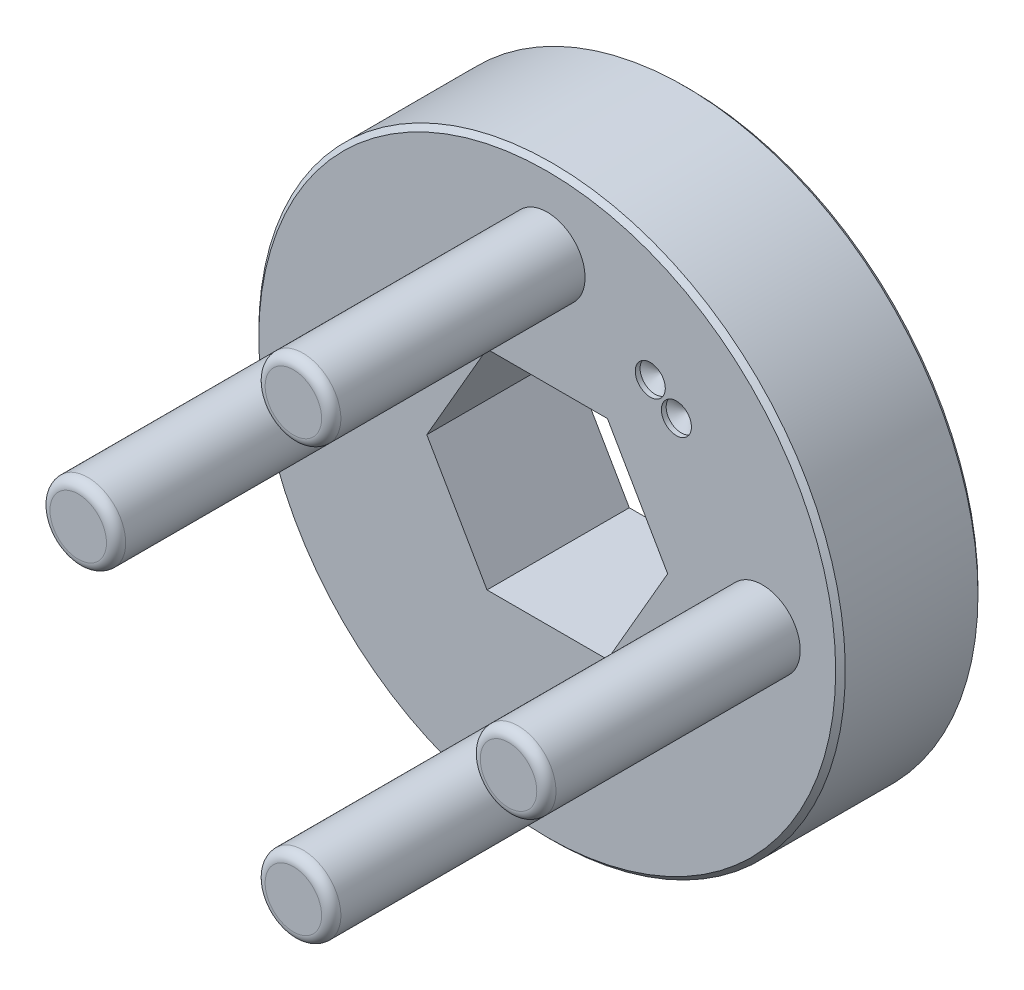
ISO-10303-21;
HEADER;
FILE_DESCRIPTION(('STEP AP214'),'2;1');
FILE_NAME('part.step','',(''),(''),'','','');
FILE_SCHEMA(('AUTOMOTIVE_DESIGN { 1 0 10303 214 1 1 1 1 }'));
ENDSEC;
DATA;
#1=APPLICATION_CONTEXT('core data for automotive mechanical design processes');
#2=APPLICATION_PROTOCOL_DEFINITION('international standard','automotive_design',2000,#1);
#3=PRODUCT_CONTEXT('',#1,'mechanical');
#4=PRODUCT('Part','Part','',(#3));
#5=PRODUCT_RELATED_PRODUCT_CATEGORY('part','',(#4));
#6=PRODUCT_DEFINITION_FORMATION('','',#4);
#7=PRODUCT_DEFINITION_CONTEXT('part definition',#1,'design');
#8=PRODUCT_DEFINITION('design','',#6,#7);
#9=PRODUCT_DEFINITION_SHAPE('','',#8);
#10=(LENGTH_UNIT() NAMED_UNIT(*) SI_UNIT(.MILLI.,.METRE.));
#11=(NAMED_UNIT(*) PLANE_ANGLE_UNIT() SI_UNIT($,.RADIAN.));
#12=(NAMED_UNIT(*) SI_UNIT($,.STERADIAN.) SOLID_ANGLE_UNIT());
#13=UNCERTAINTY_MEASURE_WITH_UNIT(LENGTH_MEASURE(1.E-05),#10,'distance_accuracy_value','');
#14=(GEOMETRIC_REPRESENTATION_CONTEXT(3) GLOBAL_UNCERTAINTY_ASSIGNED_CONTEXT((#13)) GLOBAL_UNIT_ASSIGNED_CONTEXT((#10,
#11,#12)) REPRESENTATION_CONTEXT('',''));
#15=CARTESIAN_POINT('',(0.,0.,0.));
#16=DIRECTION('',(0.,0.,1.));
#17=DIRECTION('',(1.,0.,0.));
#18=AXIS2_PLACEMENT_3D('',#15,#16,#17);
#19=CARTESIAN_POINT('',(-11.3665,1.19057767913881E-13,20.9296));
#20=DIRECTION('',(0.,0.,1.));
#21=DIRECTION('',(1.,0.,0.));
#22=AXIS2_PLACEMENT_3D('',#19,#20,#21);
#23=PLANE('',#22);
#24=CARTESIAN_POINT('',(-11.3665,1.19057767913881E-13,20.9296));
#25=DIRECTION('',(0.,0.,-1.));
#26=DIRECTION('',(-1.,0.,0.));
#27=AXIS2_PLACEMENT_3D('',#24,#25,#26);
#28=CIRCLE('',#27,1.492);
#29=CARTESIAN_POINT('',(-12.8585,1.19252927627794E-13,20.9296));
#30=VERTEX_POINT('',#29);
#31=CARTESIAN_POINT('',(-9.8745,1.19057767913881E-13,20.9296));
#32=VERTEX_POINT('',#31);
#33=EDGE_CURVE('E216',#30,#32,#28,.T.);
#34=ORIENTED_EDGE('',*,*,#33,.F.);
#35=CARTESIAN_POINT('',(-11.3665,1.19057767913881E-13,20.9296));
#36=DIRECTION('',(0.,0.,-1.));
#37=DIRECTION('',(1.,0.,0.));
#38=AXIS2_PLACEMENT_3D('',#35,#36,#37);
#39=CIRCLE('',#38,1.492);
#40=EDGE_CURVE('E213',#32,#30,#39,.T.);
#41=ORIENTED_EDGE('',*,*,#40,.F.);
#42=EDGE_LOOP('',(#34,#41));
#43=FACE_BOUND('',#42,.T.);
#44=ADVANCED_FACE('F17',(#43),#23,.T.);
#45=CARTESIAN_POINT('',(0.,-11.3665,20.9296));
#46=DIRECTION('',(0.,0.,1.));
#47=DIRECTION('',(1.,0.,0.));
#48=AXIS2_PLACEMENT_3D('',#45,#46,#47);
#49=PLANE('',#48);
#50=CARTESIAN_POINT('',(0.,-11.3665,20.9296));
#51=DIRECTION('',(0.,0.,-1.));
#52=DIRECTION('',(-1.,0.,0.));
#53=AXIS2_PLACEMENT_3D('',#50,#51,#52);
#54=CIRCLE('',#53,1.492);
#55=CARTESIAN_POINT('',(-1.492,-11.3665,20.9296));
#56=VERTEX_POINT('',#55);
#57=CARTESIAN_POINT('',(1.492,-11.3665,20.9296));
#58=VERTEX_POINT('',#57);
#59=EDGE_CURVE('E292',#56,#58,#54,.T.);
#60=ORIENTED_EDGE('',*,*,#59,.F.);
#61=CARTESIAN_POINT('',(0.,-11.3665,20.9296));
#62=DIRECTION('',(0.,0.,-1.));
#63=DIRECTION('',(1.,0.,0.));
#64=AXIS2_PLACEMENT_3D('',#61,#62,#63);
#65=CIRCLE('',#64,1.492);
#66=EDGE_CURVE('E220',#58,#56,#65,.T.);
#67=ORIENTED_EDGE('',*,*,#66,.F.);
#68=EDGE_LOOP('',(#60,#67));
#69=FACE_BOUND('',#68,.T.);
#70=ADVANCED_FACE('F294',(#69),#49,.T.);
#71=CARTESIAN_POINT('',(11.3665,0.,20.9296));
#72=DIRECTION('',(0.,0.,1.));
#73=DIRECTION('',(1.,0.,0.));
#74=AXIS2_PLACEMENT_3D('',#71,#72,#73);
#75=PLANE('',#74);
#76=CARTESIAN_POINT('',(11.3665,0.,20.9296));
#77=DIRECTION('',(0.,0.,-1.));
#78=DIRECTION('',(-1.,0.,0.));
#79=AXIS2_PLACEMENT_3D('',#76,#77,#78);
#80=CIRCLE('',#79,1.492);
#81=CARTESIAN_POINT('',(9.8745,0.,20.9296));
#82=VERTEX_POINT('',#81);
#83=CARTESIAN_POINT('',(12.8585,0.,20.9296));
#84=VERTEX_POINT('',#83);
#85=EDGE_CURVE('E288',#82,#84,#80,.T.);
#86=ORIENTED_EDGE('',*,*,#85,.F.);
#87=CARTESIAN_POINT('',(11.3665,0.,20.9296));
#88=DIRECTION('',(0.,0.,-1.));
#89=DIRECTION('',(1.,0.,0.));
#90=AXIS2_PLACEMENT_3D('',#87,#88,#89);
#91=CIRCLE('',#90,1.492);
#92=EDGE_CURVE('E279',#84,#82,#91,.T.);
#93=ORIENTED_EDGE('',*,*,#92,.F.);
#94=EDGE_LOOP('',(#86,#93));
#95=FACE_BOUND('',#94,.T.);
#96=ADVANCED_FACE('F137',(#95),#75,.T.);
#97=CARTESIAN_POINT('',(0.,11.3665,20.9296));
#98=DIRECTION('',(0.,0.,1.));
#99=DIRECTION('',(1.,0.,0.));
#100=AXIS2_PLACEMENT_3D('',#97,#98,#99);
#101=PLANE('',#100);
#102=CARTESIAN_POINT('',(0.,11.3665,20.9296));
#103=DIRECTION('',(0.,0.,-1.));
#104=DIRECTION('',(-1.,0.,0.));
#105=AXIS2_PLACEMENT_3D('',#102,#103,#104);
#106=CIRCLE('',#105,1.492);
#107=CARTESIAN_POINT('',(-1.492,11.3665,20.9296));
#108=VERTEX_POINT('',#107);
#109=CARTESIAN_POINT('',(1.492,11.3665,20.9296));
#110=VERTEX_POINT('',#109);
#111=EDGE_CURVE('E112',#108,#110,#106,.T.);
#112=ORIENTED_EDGE('',*,*,#111,.F.);
#113=CARTESIAN_POINT('',(0.,11.3665,20.9296));
#114=DIRECTION('',(0.,0.,-1.));
#115=DIRECTION('',(1.,0.,0.));
#116=AXIS2_PLACEMENT_3D('',#113,#114,#115);
#117=CIRCLE('',#116,1.492);
#118=EDGE_CURVE('E117',#110,#108,#117,.T.);
#119=ORIENTED_EDGE('',*,*,#118,.F.);
#120=EDGE_LOOP('',(#112,#119));
#121=FACE_BOUND('',#120,.T.);
#122=ADVANCED_FACE('F105',(#121),#101,.T.);
#123=CARTESIAN_POINT('',(5.44497650823394,8.41824079302751,7.26439999999684));
#124=DIRECTION('',(0.,0.,1.));
#125=DIRECTION('',(0.,-1.,0.));
#126=AXIS2_PLACEMENT_3D('',#123,#124,#125);
#127=CONICAL_SURFACE('',#126,0.793749999995381,1.02974425861255);
#128=CARTESIAN_POINT('',(5.44497650830067,8.41824079302751,6.78746688365095));
#129=VERTEX_POINT('',#128);
#130=VERTEX_LOOP('',#129);
#131=FACE_BOUND('',#130,.T.);
#132=CARTESIAN_POINT('',(5.44497650823394,8.41824079302751,7.2644));
#133=DIRECTION('',(0.,0.,1.));
#134=DIRECTION('',(1.,0.,0.));
#135=AXIS2_PLACEMENT_3D('',#132,#133,#134);
#136=CIRCLE('',#135,0.793749999999994);
#137=CARTESIAN_POINT('',(6.23872650823393,8.41824079302751,7.2644));
#138=VERTEX_POINT('',#137);
#139=EDGE_CURVE('E109',#138,#138,#136,.T.);
#140=ORIENTED_EDGE('',*,*,#139,.T.);
#141=EDGE_LOOP('',(#140));
#142=FACE_BOUND('',#141,.T.);
#143=ADVANCED_FACE('F101',(#131,#142),#127,.F.);
#144=CARTESIAN_POINT('',(6.82406725314877,7.34483855160306,7.26440000011053));
#145=DIRECTION('',(0.,0.,1.));
#146=DIRECTION('',(1.,0.,0.));
#147=AXIS2_PLACEMENT_3D('',#144,#145,#146);
#148=CONICAL_SURFACE('',#147,0.793750000127602,1.0297442586964);
#149=CARTESIAN_POINT('',(6.82406725314877,7.34483855160306,6.78746688373622));
#150=VERTEX_POINT('',#149);
#151=VERTEX_LOOP('',#150);
#152=FACE_BOUND('',#151,.T.);
#153=CARTESIAN_POINT('',(6.82406725314877,7.34483855160306,7.2644));
#154=DIRECTION('',(0.,0.,1.));
#155=DIRECTION('',(1.,0.,0.));
#156=AXIS2_PLACEMENT_3D('',#153,#154,#155);
#157=CIRCLE('',#156,0.793749999999994);
#158=CARTESIAN_POINT('',(7.61781725314876,7.34483855160306,7.2644));
#159=VERTEX_POINT('',#158);
#160=EDGE_CURVE('E111',#159,#159,#157,.T.);
#161=ORIENTED_EDGE('',*,*,#160,.T.);
#162=EDGE_LOOP('',(#161));
#163=FACE_BOUND('',#162,.T.);
#164=ADVANCED_FACE('F104',(#152,#163),#148,.F.);
#165=CARTESIAN_POINT('',(-11.3665,1.19057767913881E-13,20.4216));
#166=DIRECTION('',(0.,0.,1.));
#167=DIRECTION('',(1.,0.,0.));
#168=AXIS2_PLACEMENT_3D('',#165,#166,#167);
#169=TOROIDAL_SURFACE('',#168,1.492,0.508);
#170=ORIENTED_EDGE('',*,*,#40,.T.);
#171=ORIENTED_EDGE('',*,*,#33,.T.);
#172=EDGE_LOOP('',(#170,#171));
#173=FACE_BOUND('',#172,.T.);
#174=CARTESIAN_POINT('',(-11.3665,1.19057767913881E-13,20.4216));
#175=DIRECTION('',(0.,0.,-1.));
#176=DIRECTION('',(-1.,0.,0.));
#177=AXIS2_PLACEMENT_3D('',#174,#175,#176);
#178=CIRCLE('',#177,2.);
#179=CARTESIAN_POINT('',(-13.3665,1.19057767913881E-13,20.4216));
#180=VERTEX_POINT('',#179);
#181=EDGE_CURVE('E115',#180,#180,#178,.T.);
#182=ORIENTED_EDGE('',*,*,#181,.F.);
#183=EDGE_LOOP('',(#182));
#184=FACE_BOUND('',#183,.T.);
#185=ADVANCED_FACE('F192',(#173,#184),#169,.T.);
#186=CARTESIAN_POINT('',(0.,-11.3665,20.4216));
#187=DIRECTION('',(0.,0.,1.));
#188=DIRECTION('',(1.,0.,0.));
#189=AXIS2_PLACEMENT_3D('',#186,#187,#188);
#190=TOROIDAL_SURFACE('',#189,1.492,0.508);
#191=ORIENTED_EDGE('',*,*,#66,.T.);
#192=ORIENTED_EDGE('',*,*,#59,.T.);
#193=EDGE_LOOP('',(#191,#192));
#194=FACE_BOUND('',#193,.T.);
#195=CARTESIAN_POINT('',(0.,-11.3665,20.4216));
#196=DIRECTION('',(0.,0.,-1.));
#197=DIRECTION('',(-1.,0.,0.));
#198=AXIS2_PLACEMENT_3D('',#195,#196,#197);
#199=CIRCLE('',#198,2.);
#200=CARTESIAN_POINT('',(-2.,-11.3665,20.4216));
#201=VERTEX_POINT('',#200);
#202=EDGE_CURVE('E182',#201,#201,#199,.T.);
#203=ORIENTED_EDGE('',*,*,#202,.F.);
#204=EDGE_LOOP('',(#203));
#205=FACE_BOUND('',#204,.T.);
#206=ADVANCED_FACE('F189',(#194,#205),#190,.T.);
#207=CARTESIAN_POINT('',(11.3665,0.,20.4216));
#208=DIRECTION('',(0.,0.,1.));
#209=DIRECTION('',(1.,0.,0.));
#210=AXIS2_PLACEMENT_3D('',#207,#208,#209);
#211=TOROIDAL_SURFACE('',#210,1.492,0.508);
#212=ORIENTED_EDGE('',*,*,#92,.T.);
#213=ORIENTED_EDGE('',*,*,#85,.T.);
#214=EDGE_LOOP('',(#212,#213));
#215=FACE_BOUND('',#214,.T.);
#216=CARTESIAN_POINT('',(11.3665,0.,20.4216));
#217=DIRECTION('',(0.,0.,-1.));
#218=DIRECTION('',(-1.,0.,0.));
#219=AXIS2_PLACEMENT_3D('',#216,#217,#218);
#220=CIRCLE('',#219,2.);
#221=CARTESIAN_POINT('',(9.3665,0.,20.4216));
#222=VERTEX_POINT('',#221);
#223=EDGE_CURVE('E180',#222,#222,#220,.T.);
#224=ORIENTED_EDGE('',*,*,#223,.F.);
#225=EDGE_LOOP('',(#224));
#226=FACE_BOUND('',#225,.T.);
#227=ADVANCED_FACE('F169',(#215,#226),#211,.T.);
#228=CARTESIAN_POINT('',(0.,11.3665,20.4216));
#229=DIRECTION('',(0.,0.,1.));
#230=DIRECTION('',(1.,0.,0.));
#231=AXIS2_PLACEMENT_3D('',#228,#229,#230);
#232=TOROIDAL_SURFACE('',#231,1.492,0.508);
#233=ORIENTED_EDGE('',*,*,#118,.T.);
#234=ORIENTED_EDGE('',*,*,#111,.T.);
#235=EDGE_LOOP('',(#233,#234));
#236=FACE_BOUND('',#235,.T.);
#237=CARTESIAN_POINT('',(0.,11.3665,20.4216));
#238=DIRECTION('',(0.,0.,-1.));
#239=DIRECTION('',(-1.,0.,0.));
#240=AXIS2_PLACEMENT_3D('',#237,#238,#239);
#241=CIRCLE('',#240,2.);
#242=CARTESIAN_POINT('',(-2.,11.3665,20.4216));
#243=VERTEX_POINT('',#242);
#244=EDGE_CURVE('E178',#243,#243,#241,.T.);
#245=ORIENTED_EDGE('',*,*,#244,.F.);
#246=EDGE_LOOP('',(#245));
#247=FACE_BOUND('',#246,.T.);
#248=ADVANCED_FACE('F157',(#236,#247),#232,.T.);
#249=CARTESIAN_POINT('',(5.44497650823394,8.41824079302751,7.5184));
#250=DIRECTION('',(0.,0.,1.));
#251=DIRECTION('',(1.,0.,0.));
#252=AXIS2_PLACEMENT_3D('',#249,#250,#251);
#253=CYLINDRICAL_SURFACE('',#252,0.793749999999994);
#254=CARTESIAN_POINT('',(5.44497650823394,8.41824079302751,7.5184));
#255=DIRECTION('',(0.,0.,1.));
#256=DIRECTION('',(1.,0.,0.));
#257=AXIS2_PLACEMENT_3D('',#254,#255,#256);
#258=CIRCLE('',#257,0.793749999999994);
#259=CARTESIAN_POINT('',(6.23872650823393,8.41824079302751,7.5184));
#260=VERTEX_POINT('',#259);
#261=EDGE_CURVE('E265',#260,#260,#258,.F.);
#262=ORIENTED_EDGE('',*,*,#261,.F.);
#263=EDGE_LOOP('',(#262));
#264=FACE_BOUND('',#263,.T.);
#265=ORIENTED_EDGE('',*,*,#139,.F.);
#266=EDGE_LOOP('',(#265));
#267=FACE_BOUND('',#266,.T.);
#268=ADVANCED_FACE('F168',(#264,#267),#253,.F.);
#269=CARTESIAN_POINT('',(6.82406725314877,7.34483855160306,7.5184));
#270=DIRECTION('',(0.,0.,1.));
#271=DIRECTION('',(1.,0.,0.));
#272=AXIS2_PLACEMENT_3D('',#269,#270,#271);
#273=CYLINDRICAL_SURFACE('',#272,0.793749999999994);
#274=CARTESIAN_POINT('',(6.82406725314877,7.34483855160306,7.5184));
#275=DIRECTION('',(0.,0.,1.));
#276=DIRECTION('',(1.,0.,0.));
#277=AXIS2_PLACEMENT_3D('',#274,#275,#276);
#278=CIRCLE('',#277,0.793749999999994);
#279=CARTESIAN_POINT('',(7.61781725314876,7.34483855160306,7.5184));
#280=VERTEX_POINT('',#279);
#281=EDGE_CURVE('E262',#280,#280,#278,.F.);
#282=ORIENTED_EDGE('',*,*,#281,.F.);
#283=EDGE_LOOP('',(#282));
#284=FACE_BOUND('',#283,.T.);
#285=ORIENTED_EDGE('',*,*,#160,.F.);
#286=EDGE_LOOP('',(#285));
#287=FACE_BOUND('',#286,.T.);
#288=ADVANCED_FACE('F362',(#284,#287),#273,.F.);
#289=CARTESIAN_POINT('',(-11.3665,1.19057767913881E-13,20.9296));
#290=DIRECTION('',(0.,0.,-1.));
#291=DIRECTION('',(-1.,0.,0.));
#292=AXIS2_PLACEMENT_3D('',#289,#290,#291);
#293=CYLINDRICAL_SURFACE('',#292,2.);
#294=CARTESIAN_POINT('',(-11.3665,1.19057767913881E-13,7.5184));
#295=DIRECTION('',(0.,0.,-1.));
#296=DIRECTION('',(-1.,0.,0.));
#297=AXIS2_PLACEMENT_3D('',#294,#295,#296);
#298=CIRCLE('',#297,2.);
#299=CARTESIAN_POINT('',(-13.3665,1.19057767913881E-13,7.5184));
#300=VERTEX_POINT('',#299);
#301=EDGE_CURVE('E259',#300,#300,#298,.T.);
#302=ORIENTED_EDGE('',*,*,#301,.F.);
#303=EDGE_LOOP('',(#302));
#304=FACE_BOUND('',#303,.T.);
#305=ORIENTED_EDGE('',*,*,#181,.T.);
#306=EDGE_LOOP('',(#305));
#307=FACE_BOUND('',#306,.T.);
#308=ADVANCED_FACE('F359',(#304,#307),#293,.T.);
#309=CARTESIAN_POINT('',(0.,-11.3665,20.9296));
#310=DIRECTION('',(0.,0.,-1.));
#311=DIRECTION('',(-1.,0.,0.));
#312=AXIS2_PLACEMENT_3D('',#309,#310,#311);
#313=CYLINDRICAL_SURFACE('',#312,2.);
#314=CARTESIAN_POINT('',(0.,-11.3665,7.5184));
#315=DIRECTION('',(0.,0.,-1.));
#316=DIRECTION('',(-1.,0.,0.));
#317=AXIS2_PLACEMENT_3D('',#314,#315,#316);
#318=CIRCLE('',#317,2.);
#319=CARTESIAN_POINT('',(-2.,-11.3665,7.5184));
#320=VERTEX_POINT('',#319);
#321=EDGE_CURVE('E256',#320,#320,#318,.T.);
#322=ORIENTED_EDGE('',*,*,#321,.F.);
#323=EDGE_LOOP('',(#322));
#324=FACE_BOUND('',#323,.T.);
#325=ORIENTED_EDGE('',*,*,#202,.T.);
#326=EDGE_LOOP('',(#325));
#327=FACE_BOUND('',#326,.T.);
#328=ADVANCED_FACE('F355',(#324,#327),#313,.T.);
#329=CARTESIAN_POINT('',(11.3665,0.,20.9296));
#330=DIRECTION('',(0.,0.,-1.));
#331=DIRECTION('',(-1.,0.,0.));
#332=AXIS2_PLACEMENT_3D('',#329,#330,#331);
#333=CYLINDRICAL_SURFACE('',#332,2.);
#334=CARTESIAN_POINT('',(11.3665,0.,7.5184));
#335=DIRECTION('',(0.,0.,-1.));
#336=DIRECTION('',(-1.,0.,0.));
#337=AXIS2_PLACEMENT_3D('',#334,#335,#336);
#338=CIRCLE('',#337,2.);
#339=CARTESIAN_POINT('',(9.3665,0.,7.5184));
#340=VERTEX_POINT('',#339);
#341=EDGE_CURVE('E253',#340,#340,#338,.T.);
#342=ORIENTED_EDGE('',*,*,#341,.F.);
#343=EDGE_LOOP('',(#342));
#344=FACE_BOUND('',#343,.T.);
#345=ORIENTED_EDGE('',*,*,#223,.T.);
#346=EDGE_LOOP('',(#345));
#347=FACE_BOUND('',#346,.T.);
#348=ADVANCED_FACE('F351',(#344,#347),#333,.T.);
#349=CARTESIAN_POINT('',(0.,11.3665,20.9296));
#350=DIRECTION('',(0.,0.,-1.));
#351=DIRECTION('',(-1.,0.,0.));
#352=AXIS2_PLACEMENT_3D('',#349,#350,#351);
#353=CYLINDRICAL_SURFACE('',#352,2.);
#354=CARTESIAN_POINT('',(0.,11.3665,7.5184));
#355=DIRECTION('',(0.,0.,-1.));
#356=DIRECTION('',(-1.,0.,0.));
#357=AXIS2_PLACEMENT_3D('',#354,#355,#356);
#358=CIRCLE('',#357,2.);
#359=CARTESIAN_POINT('',(-2.,11.3665,7.5184));
#360=VERTEX_POINT('',#359);
#361=EDGE_CURVE('E250',#360,#360,#358,.T.);
#362=ORIENTED_EDGE('',*,*,#361,.F.);
#363=EDGE_LOOP('',(#362));
#364=FACE_BOUND('',#363,.T.);
#365=ORIENTED_EDGE('',*,*,#244,.T.);
#366=EDGE_LOOP('',(#365));
#367=FACE_BOUND('',#366,.T.);
#368=ADVANCED_FACE('F347',(#364,#367),#353,.T.);
#369=CARTESIAN_POINT('',(0.,0.,7.26440000000001));
#370=DIRECTION('',(0.,0.,-1.));
#371=DIRECTION('',(0.,1.,0.));
#372=AXIS2_PLACEMENT_3D('',#369,#370,#371);
#373=CONICAL_SURFACE('',#372,15.494,0.785398163397442);
#374=CARTESIAN_POINT('',(0.,0.,7.5184));
#375=DIRECTION('',(0.,0.,-1.));
#376=DIRECTION('',(0.,1.,0.));
#377=AXIS2_PLACEMENT_3D('',#374,#375,#376);
#378=CIRCLE('',#377,15.24);
#379=CARTESIAN_POINT('',(0.,15.24,7.5184));
#380=VERTEX_POINT('',#379);
#381=EDGE_CURVE('E246',#380,#380,#378,.F.);
#382=ORIENTED_EDGE('',*,*,#381,.F.);
#383=EDGE_LOOP('',(#382));
#384=FACE_BOUND('',#383,.T.);
#385=CARTESIAN_POINT('',(0.,0.,7.26440000000001));
#386=DIRECTION('',(0.,0.,-1.));
#387=DIRECTION('',(-1.,0.,0.));
#388=AXIS2_PLACEMENT_3D('',#385,#386,#387);
#389=CIRCLE('',#388,15.494);
#390=CARTESIAN_POINT('',(-15.494,0.,7.26440000000001));
#391=VERTEX_POINT('',#390);
#392=EDGE_CURVE('E249',#391,#391,#389,.T.);
#393=ORIENTED_EDGE('',*,*,#392,.F.);
#394=EDGE_LOOP('',(#393));
#395=FACE_BOUND('',#394,.T.);
#396=ADVANCED_FACE('F343',(#384,#395),#373,.T.);
#397=CARTESIAN_POINT('',(0.,0.,7.5184));
#398=DIRECTION('',(0.,0.,1.));
#399=DIRECTION('',(1.,0.,0.));
#400=AXIS2_PLACEMENT_3D('',#397,#398,#399);
#401=PLANE('',#400);
#402=ORIENTED_EDGE('',*,*,#381,.T.);
#403=EDGE_LOOP('',(#402));
#404=FACE_BOUND('',#403,.T.);
#405=DIRECTION('',(1.,0.,0.));
#406=VECTOR('',#405,1.);
#407=CARTESIAN_POINT('',(3.18135,5.51025983665925,7.5184));
#408=LINE('',#407,#406);
#409=CARTESIAN_POINT('',(-3.18135,5.51025983665925,7.5184));
#410=VERTEX_POINT('',#409);
#411=CARTESIAN_POINT('',(3.18135,5.51025983665925,7.5184));
#412=VERTEX_POINT('',#411);
#413=EDGE_CURVE('E584',#410,#412,#408,.T.);
#414=ORIENTED_EDGE('',*,*,#413,.T.);
#415=DIRECTION('',(-0.5,0.866025403784439,0.));
#416=VECTOR('',#415,1.);
#417=CARTESIAN_POINT('',(6.3627,0.,7.5184));
#418=LINE('',#417,#416);
#419=CARTESIAN_POINT('',(6.3627,0.,7.5184));
#420=VERTEX_POINT('',#419);
#421=EDGE_CURVE('E589',#412,#420,#418,.F.);
#422=ORIENTED_EDGE('',*,*,#421,.T.);
#423=DIRECTION('',(0.5,0.866025403784439,0.));
#424=VECTOR('',#423,1.);
#425=CARTESIAN_POINT('',(3.18135,-5.51025983665925,7.5184));
#426=LINE('',#425,#424);
#427=CARTESIAN_POINT('',(3.18135,-5.51025983665925,7.5184));
#428=VERTEX_POINT('',#427);
#429=EDGE_CURVE('E594',#420,#428,#426,.F.);
#430=ORIENTED_EDGE('',*,*,#429,.T.);
#431=DIRECTION('',(1.,0.,0.));
#432=VECTOR('',#431,1.);
#433=CARTESIAN_POINT('',(-3.18135,-5.51025983665925,7.5184));
#434=LINE('',#433,#432);
#435=CARTESIAN_POINT('',(-3.18135,-5.51025983665925,7.5184));
#436=VERTEX_POINT('',#435);
#437=EDGE_CURVE('E575',#428,#436,#434,.F.);
#438=ORIENTED_EDGE('',*,*,#437,.T.);
#439=DIRECTION('',(0.5,-0.866025403784439,0.));
#440=VECTOR('',#439,1.);
#441=CARTESIAN_POINT('',(-6.3627,0.,7.5184));
#442=LINE('',#441,#440);
#443=CARTESIAN_POINT('',(-6.3627,0.,7.5184));
#444=VERTEX_POINT('',#443);
#445=EDGE_CURVE('E568',#436,#444,#442,.F.);
#446=ORIENTED_EDGE('',*,*,#445,.T.);
#447=DIRECTION('',(-0.5,-0.866025403784439,0.));
#448=VECTOR('',#447,1.);
#449=CARTESIAN_POINT('',(-3.18135,5.51025983665925,7.5184));
#450=LINE('',#449,#448);
#451=EDGE_CURVE('E579',#444,#410,#450,.F.);
#452=ORIENTED_EDGE('',*,*,#451,.T.);
#453=EDGE_LOOP('',(#414,#422,#430,#438,#446,#452));
#454=FACE_BOUND('',#453,.T.);
#455=ORIENTED_EDGE('',*,*,#361,.T.);
#456=EDGE_LOOP('',(#455));
#457=FACE_BOUND('',#456,.T.);
#458=ORIENTED_EDGE('',*,*,#341,.T.);
#459=EDGE_LOOP('',(#458));
#460=FACE_BOUND('',#459,.T.);
#461=ORIENTED_EDGE('',*,*,#321,.T.);
#462=EDGE_LOOP('',(#461));
#463=FACE_BOUND('',#462,.T.);
#464=ORIENTED_EDGE('',*,*,#301,.T.);
#465=EDGE_LOOP('',(#464));
#466=FACE_BOUND('',#465,.T.);
#467=ORIENTED_EDGE('',*,*,#281,.T.);
#468=EDGE_LOOP('',(#467));
#469=FACE_BOUND('',#468,.T.);
#470=ORIENTED_EDGE('',*,*,#261,.T.);
#471=EDGE_LOOP('',(#470));
#472=FACE_BOUND('',#471,.T.);
#473=ADVANCED_FACE('F339',(#404,#454,#457,#460,#463,#466,#469,#472),#401,.T.);
#474=CARTESIAN_POINT('',(0.,0.,7.5184));
#475=DIRECTION('',(0.,0.,-1.));
#476=DIRECTION('',(-1.,0.,0.));
#477=AXIS2_PLACEMENT_3D('',#474,#475,#476);
#478=CYLINDRICAL_SURFACE('',#477,15.494);
#479=ORIENTED_EDGE('',*,*,#392,.T.);
#480=EDGE_LOOP('',(#479));
#481=FACE_BOUND('',#480,.T.);
#482=CARTESIAN_POINT('',(0.,0.,0.254000000000004));
#483=DIRECTION('',(0.,0.,1.));
#484=DIRECTION('',(1.,0.,0.));
#485=AXIS2_PLACEMENT_3D('',#482,#483,#484);
#486=CIRCLE('',#485,15.494);
#487=CARTESIAN_POINT('',(15.494,0.,0.254000000000004));
#488=VERTEX_POINT('',#487);
#489=EDGE_CURVE('E572',#488,#488,#486,.F.);
#490=ORIENTED_EDGE('',*,*,#489,.F.);
#491=EDGE_LOOP('',(#490));
#492=FACE_BOUND('',#491,.T.);
#493=ADVANCED_FACE('F335',(#481,#492),#478,.T.);
#494=CARTESIAN_POINT('',(-6.3627,0.,0.));
#495=DIRECTION('',(-0.866025403784439,-0.5,0.));
#496=DIRECTION('',(0.5,-0.866025403784439,0.));
#497=AXIS2_PLACEMENT_3D('',#494,#495,#496);
#498=PLANE('',#497);
#499=DIRECTION('',(0.,0.,-1.));
#500=VECTOR('',#499,1.);
#501=CARTESIAN_POINT('',(-3.18135,-5.51025983665925,0.));
#502=LINE('',#501,#500);
#503=CARTESIAN_POINT('',(-3.18135,-5.51025983665925,0.));
#504=VERTEX_POINT('',#503);
#505=EDGE_CURVE('E596',#436,#504,#502,.T.);
#506=ORIENTED_EDGE('',*,*,#505,.T.);
#507=DIRECTION('',(-0.5,0.866025403784439,0.));
#508=VECTOR('',#507,1.);
#509=CARTESIAN_POINT('',(-3.18135,-5.51025983665925,0.));
#510=LINE('',#509,#508);
#511=CARTESIAN_POINT('',(-6.3627,0.,0.));
#512=VERTEX_POINT('',#511);
#513=EDGE_CURVE('E574',#504,#512,#510,.T.);
#514=ORIENTED_EDGE('',*,*,#513,.T.);
#515=DIRECTION('',(0.,0.,1.));
#516=VECTOR('',#515,1.);
#517=CARTESIAN_POINT('',(-6.3627,0.,0.));
#518=LINE('',#517,#516);
#519=EDGE_CURVE('E569',#512,#444,#518,.T.);
#520=ORIENTED_EDGE('',*,*,#519,.T.);
#521=ORIENTED_EDGE('',*,*,#445,.F.);
#522=EDGE_LOOP('',(#506,#514,#520,#521));
#523=FACE_BOUND('',#522,.T.);
#524=ADVANCED_FACE('F331',(#523),#498,.F.);
#525=CARTESIAN_POINT('',(-3.18135,5.51025983665925,0.));
#526=DIRECTION('',(-0.866025403784439,0.5,0.));
#527=DIRECTION('',(-0.5,-0.866025403784439,0.));
#528=AXIS2_PLACEMENT_3D('',#525,#526,#527);
#529=PLANE('',#528);
#530=ORIENTED_EDGE('',*,*,#519,.F.);
#531=DIRECTION('',(0.5,0.866025403784439,0.));
#532=VECTOR('',#531,1.);
#533=CARTESIAN_POINT('',(-6.3627,0.,0.));
#534=LINE('',#533,#532);
#535=CARTESIAN_POINT('',(-3.18135,5.51025983665925,0.));
#536=VERTEX_POINT('',#535);
#537=EDGE_CURVE('E604',#512,#536,#534,.T.);
#538=ORIENTED_EDGE('',*,*,#537,.T.);
#539=DIRECTION('',(0.,0.,1.));
#540=VECTOR('',#539,1.);
#541=CARTESIAN_POINT('',(-3.18135,5.51025983665925,0.));
#542=LINE('',#541,#540);
#543=EDGE_CURVE('E581',#536,#410,#542,.T.);
#544=ORIENTED_EDGE('',*,*,#543,.T.);
#545=ORIENTED_EDGE('',*,*,#451,.F.);
#546=EDGE_LOOP('',(#530,#538,#544,#545));
#547=FACE_BOUND('',#546,.T.);
#548=ADVANCED_FACE('F327',(#547),#529,.F.);
#549=CARTESIAN_POINT('',(3.18135,5.51025983665925,0.));
#550=DIRECTION('',(0.,1.,0.));
#551=DIRECTION('',(0.,0.,1.));
#552=AXIS2_PLACEMENT_3D('',#549,#550,#551);
#553=PLANE('',#552);
#554=ORIENTED_EDGE('',*,*,#543,.F.);
#555=DIRECTION('',(1.,0.,0.));
#556=VECTOR('',#555,1.);
#557=CARTESIAN_POINT('',(0.,5.51025983665925,0.));
#558=LINE('',#557,#556);
#559=CARTESIAN_POINT('',(3.18135,5.51025983665925,0.));
#560=VERTEX_POINT('',#559);
#561=EDGE_CURVE('E607',#536,#560,#558,.T.);
#562=ORIENTED_EDGE('',*,*,#561,.T.);
#563=DIRECTION('',(0.,0.,1.));
#564=VECTOR('',#563,1.);
#565=CARTESIAN_POINT('',(3.18135,5.51025983665925,0.));
#566=LINE('',#565,#564);
#567=EDGE_CURVE('E586',#560,#412,#566,.T.);
#568=ORIENTED_EDGE('',*,*,#567,.T.);
#569=ORIENTED_EDGE('',*,*,#413,.F.);
#570=EDGE_LOOP('',(#554,#562,#568,#569));
#571=FACE_BOUND('',#570,.T.);
#572=ADVANCED_FACE('F323',(#571),#553,.F.);
#573=CARTESIAN_POINT('',(6.3627,0.,0.));
#574=DIRECTION('',(0.866025403784439,0.5,0.));
#575=DIRECTION('',(-0.5,0.866025403784439,0.));
#576=AXIS2_PLACEMENT_3D('',#573,#574,#575);
#577=PLANE('',#576);
#578=ORIENTED_EDGE('',*,*,#567,.F.);
#579=DIRECTION('',(0.5,-0.866025403784439,0.));
#580=VECTOR('',#579,1.);
#581=CARTESIAN_POINT('',(3.18135,5.51025983665925,0.));
#582=LINE('',#581,#580);
#583=CARTESIAN_POINT('',(6.3627,0.,0.));
#584=VERTEX_POINT('',#583);
#585=EDGE_CURVE('E610',#560,#584,#582,.T.);
#586=ORIENTED_EDGE('',*,*,#585,.T.);
#587=DIRECTION('',(0.,0.,1.));
#588=VECTOR('',#587,1.);
#589=CARTESIAN_POINT('',(6.3627,0.,0.));
#590=LINE('',#589,#588);
#591=EDGE_CURVE('E591',#584,#420,#590,.T.);
#592=ORIENTED_EDGE('',*,*,#591,.T.);
#593=ORIENTED_EDGE('',*,*,#421,.F.);
#594=EDGE_LOOP('',(#578,#586,#592,#593));
#595=FACE_BOUND('',#594,.T.);
#596=ADVANCED_FACE('F319',(#595),#577,.F.);
#597=CARTESIAN_POINT('',(3.18135,-5.51025983665925,0.));
#598=DIRECTION('',(0.866025403784439,-0.5,0.));
#599=DIRECTION('',(0.5,0.866025403784439,0.));
#600=AXIS2_PLACEMENT_3D('',#597,#598,#599);
#601=PLANE('',#600);
#602=ORIENTED_EDGE('',*,*,#591,.F.);
#603=DIRECTION('',(-0.5,-0.866025403784439,0.));
#604=VECTOR('',#603,1.);
#605=CARTESIAN_POINT('',(6.3627,0.,0.));
#606=LINE('',#605,#604);
#607=CARTESIAN_POINT('',(3.18135,-5.51025983665925,0.));
#608=VERTEX_POINT('',#607);
#609=EDGE_CURVE('E613',#584,#608,#606,.T.);
#610=ORIENTED_EDGE('',*,*,#609,.T.);
#611=DIRECTION('',(0.,0.,-1.));
#612=VECTOR('',#611,1.);
#613=CARTESIAN_POINT('',(3.18135,-5.51025983665925,0.));
#614=LINE('',#613,#612);
#615=EDGE_CURVE('E38',#608,#428,#614,.F.);
#616=ORIENTED_EDGE('',*,*,#615,.T.);
#617=ORIENTED_EDGE('',*,*,#429,.F.);
#618=EDGE_LOOP('',(#602,#610,#616,#617));
#619=FACE_BOUND('',#618,.T.);
#620=ADVANCED_FACE('F316',(#619),#601,.F.);
#621=CARTESIAN_POINT('',(-3.18135,-5.51025983665925,0.));
#622=DIRECTION('',(0.,-1.,0.));
#623=DIRECTION('',(0.,0.,-1.));
#624=AXIS2_PLACEMENT_3D('',#621,#622,#623);
#625=PLANE('',#624);
#626=ORIENTED_EDGE('',*,*,#615,.F.);
#627=DIRECTION('',(1.,0.,0.));
#628=VECTOR('',#627,1.);
#629=CARTESIAN_POINT('',(0.,-5.51025983665925,0.));
#630=LINE('',#629,#628);
#631=EDGE_CURVE('E29',#608,#504,#630,.F.);
#632=ORIENTED_EDGE('',*,*,#631,.T.);
#633=ORIENTED_EDGE('',*,*,#505,.F.);
#634=ORIENTED_EDGE('',*,*,#437,.F.);
#635=EDGE_LOOP('',(#626,#632,#633,#634));
#636=FACE_BOUND('',#635,.T.);
#637=ADVANCED_FACE('F308',(#636),#625,.F.);
#638=CARTESIAN_POINT('',(0.,0.,0.254000000000004));
#639=DIRECTION('',(0.,0.,1.));
#640=DIRECTION('',(1.,0.,0.));
#641=AXIS2_PLACEMENT_3D('',#638,#639,#640);
#642=CONICAL_SURFACE('',#641,15.494,0.785398163397458);
#643=CARTESIAN_POINT('',(0.,0.,0.));
#644=DIRECTION('',(0.,0.,1.));
#645=DIRECTION('',(1.,0.,0.));
#646=AXIS2_PLACEMENT_3D('',#643,#644,#645);
#647=CIRCLE('',#646,15.24);
#648=CARTESIAN_POINT('',(15.24,0.,0.));
#649=VERTEX_POINT('',#648);
#650=EDGE_CURVE('E11',#649,#649,#647,.T.);
#651=ORIENTED_EDGE('',*,*,#650,.T.);
#652=EDGE_LOOP('',(#651));
#653=FACE_BOUND('',#652,.T.);
#654=ORIENTED_EDGE('',*,*,#489,.T.);
#655=EDGE_LOOP('',(#654));
#656=FACE_BOUND('',#655,.T.);
#657=ADVANCED_FACE('F302',(#653,#656),#642,.T.);
#658=CARTESIAN_POINT('',(0.,0.,0.));
#659=DIRECTION('',(0.,0.,1.));
#660=DIRECTION('',(1.,0.,0.));
#661=AXIS2_PLACEMENT_3D('',#658,#659,#660);
#662=PLANE('',#661);
#663=ORIENTED_EDGE('',*,*,#650,.F.);
#664=EDGE_LOOP('',(#663));
#665=FACE_BOUND('',#664,.T.);
#666=ORIENTED_EDGE('',*,*,#609,.F.);
#667=ORIENTED_EDGE('',*,*,#585,.F.);
#668=ORIENTED_EDGE('',*,*,#561,.F.);
#669=ORIENTED_EDGE('',*,*,#537,.F.);
#670=ORIENTED_EDGE('',*,*,#513,.F.);
#671=ORIENTED_EDGE('',*,*,#631,.F.);
#672=EDGE_LOOP('',(#666,#667,#668,#669,#670,#671));
#673=FACE_BOUND('',#672,.T.);
#674=ADVANCED_FACE('F300',(#665,#673),#662,.F.);
#675=CLOSED_SHELL('',(#44,#70,#96,#122,#143,#164,#185,#206,#227,#248,#268,#288,#308,#328,#348,
#368,#396,#473,#493,#524,#548,#572,#596,#620,#637,#657,#674));
#676=MANIFOLD_SOLID_BREP('B1',#675);
#677=ADVANCED_BREP_SHAPE_REPRESENTATION('',(#18,#676),#14);
#678=SHAPE_DEFINITION_REPRESENTATION(#9,#677);
ENDSEC;
END-ISO-10303-21;
